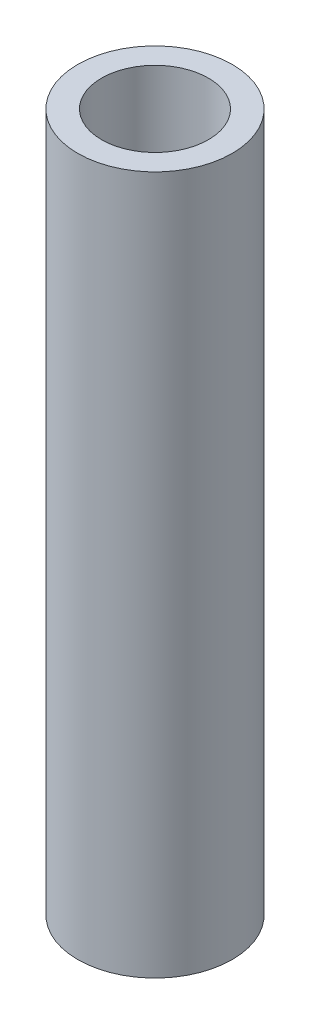
ISO-10303-21;
HEADER;
FILE_DESCRIPTION(('STEP AP214'),'2;1');
FILE_NAME('part.step','',(''),(''),'','','');
FILE_SCHEMA(('AUTOMOTIVE_DESIGN { 1 0 10303 214 1 1 1 1 }'));
ENDSEC;
DATA;
#1=APPLICATION_CONTEXT('core data for automotive mechanical design processes');
#2=APPLICATION_PROTOCOL_DEFINITION('international standard','automotive_design',2000,#1);
#3=PRODUCT_CONTEXT('',#1,'mechanical');
#4=PRODUCT('Part','Part','',(#3));
#5=PRODUCT_RELATED_PRODUCT_CATEGORY('part','',(#4));
#6=PRODUCT_DEFINITION_FORMATION('','',#4);
#7=PRODUCT_DEFINITION_CONTEXT('part definition',#1,'design');
#8=PRODUCT_DEFINITION('design','',#6,#7);
#9=PRODUCT_DEFINITION_SHAPE('','',#8);
#10=(LENGTH_UNIT() NAMED_UNIT(*) SI_UNIT(.MILLI.,.METRE.));
#11=(NAMED_UNIT(*) PLANE_ANGLE_UNIT() SI_UNIT($,.RADIAN.));
#12=(NAMED_UNIT(*) SI_UNIT($,.STERADIAN.) SOLID_ANGLE_UNIT());
#13=UNCERTAINTY_MEASURE_WITH_UNIT(LENGTH_MEASURE(1.E-05),#10,'distance_accuracy_value','');
#14=(GEOMETRIC_REPRESENTATION_CONTEXT(3) GLOBAL_UNCERTAINTY_ASSIGNED_CONTEXT((#13)) GLOBAL_UNIT_ASSIGNED_CONTEXT((#10,
#11,#12)) REPRESENTATION_CONTEXT('',''));
#15=CARTESIAN_POINT('',(0.,0.,0.));
#16=DIRECTION('',(0.,0.,1.));
#17=DIRECTION('',(1.,0.,0.));
#18=AXIS2_PLACEMENT_3D('',#15,#16,#17);
#19=CARTESIAN_POINT('',(0.,37.338,0.));
#20=DIRECTION('',(0.,1.,0.));
#21=DIRECTION('',(0.,0.,1.));
#22=AXIS2_PLACEMENT_3D('',#19,#20,#21);
#23=PLANE('',#22);
#24=CARTESIAN_POINT('',(0.,37.338,0.));
#25=DIRECTION('',(0.,1.,0.));
#26=DIRECTION('',(0.,0.,1.));
#27=AXIS2_PLACEMENT_3D('',#24,#25,#26);
#28=CIRCLE('',#27,4.127000001);
#29=CARTESIAN_POINT('',(0.,37.338,4.127000001));
#30=VERTEX_POINT('',#29);
#31=EDGE_CURVE('E10',#30,#30,#28,.T.);
#32=ORIENTED_EDGE('',*,*,#31,.T.);
#33=EDGE_LOOP('',(#32));
#34=FACE_BOUND('',#33,.T.);
#35=CARTESIAN_POINT('',(0.,37.338,0.));
#36=DIRECTION('',(0.,1.,0.));
#37=DIRECTION('',(0.,0.,1.));
#38=AXIS2_PLACEMENT_3D('',#35,#36,#37);
#39=CIRCLE('',#38,2.857000001);
#40=CARTESIAN_POINT('',(0.,37.338,2.857000001));
#41=VERTEX_POINT('',#40);
#42=EDGE_CURVE('E48',#41,#41,#39,.T.);
#43=ORIENTED_EDGE('',*,*,#42,.F.);
#44=EDGE_LOOP('',(#43));
#45=FACE_BOUND('',#44,.T.);
#46=ADVANCED_FACE('F37',(#34,#45),#23,.T.);
#47=CARTESIAN_POINT('',(0.,0.,0.));
#48=DIRECTION('',(0.,1.,0.));
#49=DIRECTION('',(0.,0.,1.));
#50=AXIS2_PLACEMENT_3D('',#47,#48,#49);
#51=PLANE('',#50);
#52=CARTESIAN_POINT('',(0.,0.,0.));
#53=DIRECTION('',(0.,1.,0.));
#54=DIRECTION('',(0.,0.,1.));
#55=AXIS2_PLACEMENT_3D('',#52,#53,#54);
#56=CIRCLE('',#55,4.127000001);
#57=CARTESIAN_POINT('',(0.,0.,4.127000001));
#58=VERTEX_POINT('',#57);
#59=EDGE_CURVE('E41',#58,#58,#56,.T.);
#60=ORIENTED_EDGE('',*,*,#59,.F.);
#61=EDGE_LOOP('',(#60));
#62=FACE_BOUND('',#61,.T.);
#63=CARTESIAN_POINT('',(0.,0.,0.));
#64=DIRECTION('',(0.,1.,0.));
#65=DIRECTION('',(0.,0.,1.));
#66=AXIS2_PLACEMENT_3D('',#63,#64,#65);
#67=CIRCLE('',#66,2.857000001);
#68=CARTESIAN_POINT('',(0.,0.,2.857000001));
#69=VERTEX_POINT('',#68);
#70=EDGE_CURVE('E50',#69,#69,#67,.T.);
#71=ORIENTED_EDGE('',*,*,#70,.T.);
#72=EDGE_LOOP('',(#71));
#73=FACE_BOUND('',#72,.T.);
#74=ADVANCED_FACE('F60',(#62,#73),#51,.F.);
#75=CARTESIAN_POINT('',(0.,37.338,0.));
#76=DIRECTION('',(0.,-1.,0.));
#77=DIRECTION('',(0.,0.,-1.));
#78=AXIS2_PLACEMENT_3D('',#75,#76,#77);
#79=CYLINDRICAL_SURFACE('',#78,4.127000001);
#80=ORIENTED_EDGE('',*,*,#31,.F.);
#81=EDGE_LOOP('',(#80));
#82=FACE_BOUND('',#81,.T.);
#83=ORIENTED_EDGE('',*,*,#59,.T.);
#84=EDGE_LOOP('',(#83));
#85=FACE_BOUND('',#84,.T.);
#86=ADVANCED_FACE('F39',(#82,#85),#79,.T.);
#87=CARTESIAN_POINT('',(0.,37.338,0.));
#88=DIRECTION('',(0.,-1.,0.));
#89=DIRECTION('',(0.,0.,-1.));
#90=AXIS2_PLACEMENT_3D('',#87,#88,#89);
#91=CYLINDRICAL_SURFACE('',#90,2.857000001);
#92=ORIENTED_EDGE('',*,*,#42,.T.);
#93=EDGE_LOOP('',(#92));
#94=FACE_BOUND('',#93,.T.);
#95=ORIENTED_EDGE('',*,*,#70,.F.);
#96=EDGE_LOOP('',(#95));
#97=FACE_BOUND('',#96,.T.);
#98=ADVANCED_FACE('F56',(#94,#97),#91,.F.);
#99=CLOSED_SHELL('',(#46,#74,#86,#98));
#100=MANIFOLD_SOLID_BREP('B2',#99);
#101=ADVANCED_BREP_SHAPE_REPRESENTATION('',(#18,#100),#14);
#102=SHAPE_DEFINITION_REPRESENTATION(#9,#101);
ENDSEC;
END-ISO-10303-21;
